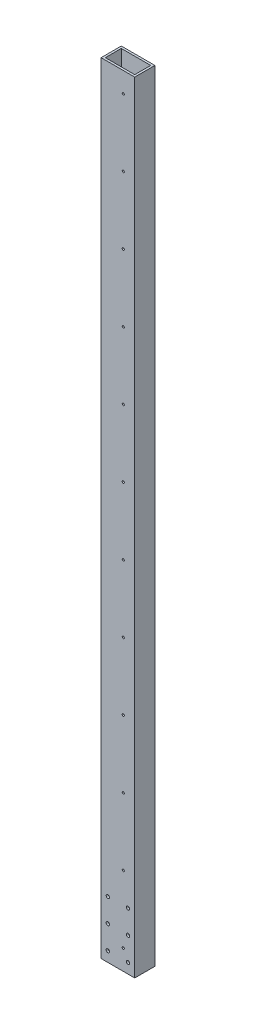
ISO-10303-21;
HEADER;
FILE_DESCRIPTION(('STEP AP214'),'2;1');
FILE_NAME('part.step','',(''),(''),'','','');
FILE_SCHEMA(('AUTOMOTIVE_DESIGN { 1 0 10303 214 1 1 1 1 }'));
ENDSEC;
DATA;
#1=APPLICATION_CONTEXT('core data for automotive mechanical design processes');
#2=APPLICATION_PROTOCOL_DEFINITION('international standard','automotive_design',2000,#1);
#3=PRODUCT_CONTEXT('',#1,'mechanical');
#4=PRODUCT('Part','Part','',(#3));
#5=PRODUCT_RELATED_PRODUCT_CATEGORY('part','',(#4));
#6=PRODUCT_DEFINITION_FORMATION('','',#4);
#7=PRODUCT_DEFINITION_CONTEXT('part definition',#1,'design');
#8=PRODUCT_DEFINITION('design','',#6,#7);
#9=PRODUCT_DEFINITION_SHAPE('','',#8);
#10=(LENGTH_UNIT() NAMED_UNIT(*) SI_UNIT(.MILLI.,.METRE.));
#11=(NAMED_UNIT(*) PLANE_ANGLE_UNIT() SI_UNIT($,.RADIAN.));
#12=(NAMED_UNIT(*) SI_UNIT($,.STERADIAN.) SOLID_ANGLE_UNIT());
#13=UNCERTAINTY_MEASURE_WITH_UNIT(LENGTH_MEASURE(1.E-05),#10,'distance_accuracy_value','');
#14=(GEOMETRIC_REPRESENTATION_CONTEXT(3) GLOBAL_UNCERTAINTY_ASSIGNED_CONTEXT((#13)) GLOBAL_UNIT_ASSIGNED_CONTEXT((#10,
#11,#12)) REPRESENTATION_CONTEXT('',''));
#15=CARTESIAN_POINT('',(0.,0.,0.));
#16=DIRECTION('',(0.,0.,1.));
#17=DIRECTION('',(1.,0.,0.));
#18=AXIS2_PLACEMENT_3D('',#15,#16,#17);
#19=CARTESIAN_POINT('',(0.,1473.2,0.));
#20=DIRECTION('',(0.,1.,0.));
#21=DIRECTION('',(0.,0.,1.));
#22=AXIS2_PLACEMENT_3D('',#19,#20,#21);
#23=PLANE('',#22);
#24=DIRECTION('',(0.,0.,1.));
#25=VECTOR('',#24,1.);
#26=CARTESIAN_POINT('',(-77.9742647058824,1473.2,5.57181372549019));
#27=LINE('',#26,#25);
#28=CARTESIAN_POINT('',(-77.9742647058824,1473.2,-32.5281862745098));
#29=VERTEX_POINT('',#28);
#30=CARTESIAN_POINT('',(-77.9742647058824,1473.2,5.57181372549019));
#31=VERTEX_POINT('',#30);
#32=EDGE_CURVE('E164',#29,#31,#27,.T.);
#33=ORIENTED_EDGE('',*,*,#32,.T.);
#34=DIRECTION('',(1.,0.,0.));
#35=VECTOR('',#34,1.);
#36=CARTESIAN_POINT('',(-77.9742647058824,1473.2,5.57181372549019));
#37=LINE('',#36,#35);
#38=CARTESIAN_POINT('',(-14.4742647058824,1473.2,5.57181372549019));
#39=VERTEX_POINT('',#38);
#40=EDGE_CURVE('E167',#31,#39,#37,.T.);
#41=ORIENTED_EDGE('',*,*,#40,.T.);
#42=DIRECTION('',(0.,0.,-1.));
#43=VECTOR('',#42,1.);
#44=CARTESIAN_POINT('',(-14.4742647058824,1473.2,5.57181372549019));
#45=LINE('',#44,#43);
#46=CARTESIAN_POINT('',(-14.4742647058824,1473.2,-32.5281862745098));
#47=VERTEX_POINT('',#46);
#48=EDGE_CURVE('E170',#39,#47,#45,.T.);
#49=ORIENTED_EDGE('',*,*,#48,.T.);
#50=DIRECTION('',(-1.,0.,0.));
#51=VECTOR('',#50,1.);
#52=CARTESIAN_POINT('',(-77.9742647058824,1473.2,-32.5281862745098));
#53=LINE('',#52,#51);
#54=EDGE_CURVE('E172',#47,#29,#53,.T.);
#55=ORIENTED_EDGE('',*,*,#54,.T.);
#56=EDGE_LOOP('',(#33,#41,#49,#55));
#57=FACE_BOUND('',#56,.T.);
#58=DIRECTION('',(1.,0.,0.));
#59=VECTOR('',#58,1.);
#60=CARTESIAN_POINT('',(0.,1473.2,1.60941372549019));
#61=LINE('',#60,#59);
#62=CARTESIAN_POINT('',(-74.0118647058824,1473.2,1.60941372549019));
#63=VERTEX_POINT('',#62);
#64=CARTESIAN_POINT('',(-18.4366647058824,1473.2,1.60941372549019));
#65=VERTEX_POINT('',#64);
#66=EDGE_CURVE('E134',#63,#65,#61,.T.);
#67=ORIENTED_EDGE('',*,*,#66,.F.);
#68=DIRECTION('',(0.,0.,1.));
#69=VECTOR('',#68,1.);
#70=CARTESIAN_POINT('',(-74.0118647058824,1473.2,0.));
#71=LINE('',#70,#69);
#72=CARTESIAN_POINT('',(-74.0118647058824,1473.2,-28.5657862745098));
#73=VERTEX_POINT('',#72);
#74=EDGE_CURVE('E126',#73,#63,#71,.T.);
#75=ORIENTED_EDGE('',*,*,#74,.F.);
#76=DIRECTION('',(-1.,0.,0.));
#77=VECTOR('',#76,1.);
#78=CARTESIAN_POINT('',(0.,1473.2,-28.5657862745098));
#79=LINE('',#78,#77);
#80=CARTESIAN_POINT('',(-18.4366647058824,1473.2,-28.5657862745098));
#81=VERTEX_POINT('',#80);
#82=EDGE_CURVE('E148',#81,#73,#79,.T.);
#83=ORIENTED_EDGE('',*,*,#82,.F.);
#84=DIRECTION('',(0.,0.,-1.));
#85=VECTOR('',#84,1.);
#86=CARTESIAN_POINT('',(-18.4366647058824,1473.2,0.));
#87=LINE('',#86,#85);
#88=EDGE_CURVE('E146',#65,#81,#87,.T.);
#89=ORIENTED_EDGE('',*,*,#88,.F.);
#90=EDGE_LOOP('',(#67,#75,#83,#89));
#91=FACE_BOUND('',#90,.T.);
#92=ADVANCED_FACE('F59',(#57,#91),#23,.T.);
#93=CARTESIAN_POINT('',(0.,0.,0.));
#94=DIRECTION('',(0.,1.,0.));
#95=DIRECTION('',(0.,0.,1.));
#96=AXIS2_PLACEMENT_3D('',#93,#94,#95);
#97=PLANE('',#96);
#98=DIRECTION('',(0.,0.,1.));
#99=VECTOR('',#98,1.);
#100=CARTESIAN_POINT('',(-77.9742647058824,0.,5.57181372549019));
#101=LINE('',#100,#99);
#102=CARTESIAN_POINT('',(-77.9742647058824,0.,-32.5281862745098));
#103=VERTEX_POINT('',#102);
#104=CARTESIAN_POINT('',(-77.9742647058824,0.,5.57181372549019));
#105=VERTEX_POINT('',#104);
#106=EDGE_CURVE('E142',#103,#105,#101,.T.);
#107=ORIENTED_EDGE('',*,*,#106,.F.);
#108=DIRECTION('',(-1.,0.,0.));
#109=VECTOR('',#108,1.);
#110=CARTESIAN_POINT('',(-77.9742647058824,0.,-32.5281862745098));
#111=LINE('',#110,#109);
#112=CARTESIAN_POINT('',(-14.4742647058824,0.,-32.5281862745098));
#113=VERTEX_POINT('',#112);
#114=EDGE_CURVE('E168',#113,#103,#111,.T.);
#115=ORIENTED_EDGE('',*,*,#114,.F.);
#116=DIRECTION('',(0.,0.,-1.));
#117=VECTOR('',#116,1.);
#118=CARTESIAN_POINT('',(-14.4742647058824,0.,5.57181372549019));
#119=LINE('',#118,#117);
#120=CARTESIAN_POINT('',(-14.4742647058824,0.,5.57181372549019));
#121=VERTEX_POINT('',#120);
#122=EDGE_CURVE('E179',#121,#113,#119,.T.);
#123=ORIENTED_EDGE('',*,*,#122,.F.);
#124=DIRECTION('',(1.,0.,0.));
#125=VECTOR('',#124,1.);
#126=CARTESIAN_POINT('',(-77.9742647058824,0.,5.57181372549019));
#127=LINE('',#126,#125);
#128=EDGE_CURVE('E177',#105,#121,#127,.T.);
#129=ORIENTED_EDGE('',*,*,#128,.F.);
#130=EDGE_LOOP('',(#107,#115,#123,#129));
#131=FACE_BOUND('',#130,.T.);
#132=DIRECTION('',(0.,0.,1.));
#133=VECTOR('',#132,1.);
#134=CARTESIAN_POINT('',(-74.0118647058824,0.,0.));
#135=LINE('',#134,#133);
#136=CARTESIAN_POINT('',(-74.0118647058824,0.,-28.5657862745098));
#137=VERTEX_POINT('',#136);
#138=CARTESIAN_POINT('',(-74.0118647058824,0.,1.60941372549019));
#139=VERTEX_POINT('',#138);
#140=EDGE_CURVE('E84',#137,#139,#135,.T.);
#141=ORIENTED_EDGE('',*,*,#140,.T.);
#142=DIRECTION('',(1.,0.,0.));
#143=VECTOR('',#142,1.);
#144=CARTESIAN_POINT('',(0.,0.,1.60941372549019));
#145=LINE('',#144,#143);
#146=CARTESIAN_POINT('',(-18.4366647058824,0.,1.60941372549019));
#147=VERTEX_POINT('',#146);
#148=EDGE_CURVE('E141',#139,#147,#145,.T.);
#149=ORIENTED_EDGE('',*,*,#148,.T.);
#150=DIRECTION('',(0.,0.,-1.));
#151=VECTOR('',#150,1.);
#152=CARTESIAN_POINT('',(-18.4366647058824,0.,0.));
#153=LINE('',#152,#151);
#154=CARTESIAN_POINT('',(-18.4366647058824,0.,-28.5657862745098));
#155=VERTEX_POINT('',#154);
#156=EDGE_CURVE('E156',#147,#155,#153,.T.);
#157=ORIENTED_EDGE('',*,*,#156,.T.);
#158=DIRECTION('',(-1.,0.,0.));
#159=VECTOR('',#158,1.);
#160=CARTESIAN_POINT('',(0.,0.,-28.5657862745098));
#161=LINE('',#160,#159);
#162=EDGE_CURVE('E135',#155,#137,#161,.T.);
#163=ORIENTED_EDGE('',*,*,#162,.T.);
#164=EDGE_LOOP('',(#141,#149,#157,#163));
#165=FACE_BOUND('',#164,.T.);
#166=ADVANCED_FACE('F352',(#131,#165),#97,.F.);
#167=CARTESIAN_POINT('',(-77.9742647058824,1473.2,5.57181372549019));
#168=DIRECTION('',(1.,0.,0.));
#169=DIRECTION('',(0.,0.,-1.));
#170=AXIS2_PLACEMENT_3D('',#167,#168,#169);
#171=PLANE('',#170);
#172=ORIENTED_EDGE('',*,*,#106,.T.);
#173=DIRECTION('',(0.,-1.,0.));
#174=VECTOR('',#173,1.);
#175=CARTESIAN_POINT('',(-77.9742647058824,1473.2,5.57181372549019));
#176=LINE('',#175,#174);
#177=EDGE_CURVE('E12',#31,#105,#176,.T.);
#178=ORIENTED_EDGE('',*,*,#177,.F.);
#179=ORIENTED_EDGE('',*,*,#32,.F.);
#180=DIRECTION('',(0.,-1.,0.));
#181=VECTOR('',#180,1.);
#182=CARTESIAN_POINT('',(-77.9742647058824,1473.2,-32.5281862745098));
#183=LINE('',#182,#181);
#184=EDGE_CURVE('E174',#29,#103,#183,.T.);
#185=ORIENTED_EDGE('',*,*,#184,.T.);
#186=EDGE_LOOP('',(#172,#178,#179,#185));
#187=FACE_BOUND('',#186,.T.);
#188=ADVANCED_FACE('F61',(#187),#171,.F.);
#189=CARTESIAN_POINT('',(-77.9742647058824,1473.2,5.57181372549019));
#190=DIRECTION('',(0.,0.,-1.));
#191=DIRECTION('',(-1.,0.,0.));
#192=AXIS2_PLACEMENT_3D('',#189,#190,#191);
#193=PLANE('',#192);
#194=CARTESIAN_POINT('',(-27.1742649276492,107.950000412582,5.57181372549019));
#195=DIRECTION('',(0.,0.,-1.));
#196=DIRECTION('',(-1.,0.,0.));
#197=AXIS2_PLACEMENT_3D('',#194,#195,#196);
#198=CIRCLE('',#197,3.17499999999998);
#199=CARTESIAN_POINT('',(-30.3492649276492,107.950000412582,5.57181372549019));
#200=VERTEX_POINT('',#199);
#201=EDGE_CURVE('E242',#200,#200,#198,.T.);
#202=ORIENTED_EDGE('',*,*,#201,.T.);
#203=EDGE_LOOP('',(#202));
#204=FACE_BOUND('',#203,.T.);
#205=CARTESIAN_POINT('',(-65.2742649276492,107.950000317398,5.57181372549019));
#206=DIRECTION('',(0.,0.,-1.));
#207=DIRECTION('',(-1.,0.,0.));
#208=AXIS2_PLACEMENT_3D('',#205,#206,#207);
#209=CIRCLE('',#208,3.17499999999998);
#210=CARTESIAN_POINT('',(-68.4492649276491,107.950000317398,5.57181372549019));
#211=VERTEX_POINT('',#210);
#212=EDGE_CURVE('E238',#211,#211,#209,.T.);
#213=ORIENTED_EDGE('',*,*,#212,.T.);
#214=EDGE_LOOP('',(#213));
#215=FACE_BOUND('',#214,.T.);
#216=CARTESIAN_POINT('',(-27.1742648166012,63.5000004125821,5.57181372549019));
#217=DIRECTION('',(0.,0.,-1.));
#218=DIRECTION('',(-1.,0.,0.));
#219=AXIS2_PLACEMENT_3D('',#216,#217,#218);
#220=CIRCLE('',#219,3.17499999999998);
#221=CARTESIAN_POINT('',(-30.3492648166012,63.5000004125821,5.57181372549019));
#222=VERTEX_POINT('',#221);
#223=EDGE_CURVE('E234',#222,#222,#220,.T.);
#224=ORIENTED_EDGE('',*,*,#223,.T.);
#225=EDGE_LOOP('',(#224));
#226=FACE_BOUND('',#225,.T.);
#227=CARTESIAN_POINT('',(-65.274264816601,63.5000003173981,5.57181372549019));
#228=DIRECTION('',(0.,0.,-1.));
#229=DIRECTION('',(-1.,0.,0.));
#230=AXIS2_PLACEMENT_3D('',#227,#228,#229);
#231=CIRCLE('',#230,3.17499999999998);
#232=CARTESIAN_POINT('',(-68.4492648166009,63.5000003173981,5.57181372549019));
#233=VERTEX_POINT('',#232);
#234=EDGE_CURVE('E229',#233,#233,#231,.T.);
#235=ORIENTED_EDGE('',*,*,#234,.T.);
#236=EDGE_LOOP('',(#235));
#237=FACE_BOUND('',#236,.T.);
#238=CARTESIAN_POINT('',(-27.1742647055528,19.050000412582,5.57181372549019));
#239=DIRECTION('',(0.,0.,-1.));
#240=DIRECTION('',(-1.,0.,0.));
#241=AXIS2_PLACEMENT_3D('',#238,#239,#240);
#242=CIRCLE('',#241,3.17499999999998);
#243=CARTESIAN_POINT('',(-30.3492647055527,19.050000412582,5.57181372549019));
#244=VERTEX_POINT('',#243);
#245=EDGE_CURVE('E224',#244,#244,#242,.T.);
#246=ORIENTED_EDGE('',*,*,#245,.T.);
#247=EDGE_LOOP('',(#246));
#248=FACE_BOUND('',#247,.T.);
#249=CARTESIAN_POINT('',(-65.274264705553,19.0500003173982,5.57181372549019));
#250=DIRECTION('',(0.,0.,-1.));
#251=DIRECTION('',(-1.,0.,0.));
#252=AXIS2_PLACEMENT_3D('',#249,#250,#251);
#253=CIRCLE('',#252,3.17499999999998);
#254=CARTESIAN_POINT('',(-68.4492647055529,19.0500003173982,5.57181372549019));
#255=VERTEX_POINT('',#254);
#256=EDGE_CURVE('E223',#255,#255,#253,.T.);
#257=ORIENTED_EDGE('',*,*,#256,.T.);
#258=EDGE_LOOP('',(#257));
#259=FACE_BOUND('',#258,.T.);
#260=CARTESIAN_POINT('',(-36.0642647058824,38.1,5.57181372549019));
#261=DIRECTION('',(0.,0.,1.));
#262=DIRECTION('',(1.,0.,0.));
#263=AXIS2_PLACEMENT_3D('',#260,#261,#262);
#264=CIRCLE('',#263,2.01929999999999);
#265=CARTESIAN_POINT('',(-34.0449647058824,38.1,5.57181372549019));
#266=VERTEX_POINT('',#265);
#267=EDGE_CURVE('E219',#266,#266,#264,.T.);
#268=ORIENTED_EDGE('',*,*,#267,.F.);
#269=EDGE_LOOP('',(#268));
#270=FACE_BOUND('',#269,.T.);
#271=CARTESIAN_POINT('',(-36.0642647058828,165.1,5.57181372549019));
#272=DIRECTION('',(0.,0.,1.));
#273=DIRECTION('',(1.,0.,0.));
#274=AXIS2_PLACEMENT_3D('',#271,#272,#273);
#275=CIRCLE('',#274,2.01929999999999);
#276=CARTESIAN_POINT('',(-34.0449647058828,165.1,5.57181372549019));
#277=VERTEX_POINT('',#276);
#278=EDGE_CURVE('E215',#277,#277,#275,.T.);
#279=ORIENTED_EDGE('',*,*,#278,.F.);
#280=EDGE_LOOP('',(#279));
#281=FACE_BOUND('',#280,.T.);
#282=CARTESIAN_POINT('',(-36.0642647058832,292.1,5.57181372549019));
#283=DIRECTION('',(0.,0.,1.));
#284=DIRECTION('',(1.,0.,0.));
#285=AXIS2_PLACEMENT_3D('',#282,#283,#284);
#286=CIRCLE('',#285,2.01929999999999);
#287=CARTESIAN_POINT('',(-34.0449647058833,292.1,5.57181372549019));
#288=VERTEX_POINT('',#287);
#289=EDGE_CURVE('E211',#288,#288,#286,.T.);
#290=ORIENTED_EDGE('',*,*,#289,.F.);
#291=EDGE_LOOP('',(#290));
#292=FACE_BOUND('',#291,.T.);
#293=CARTESIAN_POINT('',(-36.0642647058837,419.1,5.57181372549019));
#294=DIRECTION('',(0.,0.,1.));
#295=DIRECTION('',(1.,0.,0.));
#296=AXIS2_PLACEMENT_3D('',#293,#294,#295);
#297=CIRCLE('',#296,2.01929999999999);
#298=CARTESIAN_POINT('',(-34.0449647058837,419.1,5.57181372549019));
#299=VERTEX_POINT('',#298);
#300=EDGE_CURVE('E207',#299,#299,#297,.T.);
#301=ORIENTED_EDGE('',*,*,#300,.F.);
#302=EDGE_LOOP('',(#301));
#303=FACE_BOUND('',#302,.T.);
#304=CARTESIAN_POINT('',(-36.0642647058841,546.1,5.57181372549019));
#305=DIRECTION('',(0.,0.,1.));
#306=DIRECTION('',(1.,0.,0.));
#307=AXIS2_PLACEMENT_3D('',#304,#305,#306);
#308=CIRCLE('',#307,2.01929999999999);
#309=CARTESIAN_POINT('',(-34.0449647058841,546.1,5.57181372549019));
#310=VERTEX_POINT('',#309);
#311=EDGE_CURVE('E203',#310,#310,#308,.T.);
#312=ORIENTED_EDGE('',*,*,#311,.F.);
#313=EDGE_LOOP('',(#312));
#314=FACE_BOUND('',#313,.T.);
#315=CARTESIAN_POINT('',(-36.0642647058846,673.1,5.57181372549019));
#316=DIRECTION('',(0.,0.,1.));
#317=DIRECTION('',(1.,0.,0.));
#318=AXIS2_PLACEMENT_3D('',#315,#316,#317);
#319=CIRCLE('',#318,2.01929999999999);
#320=CARTESIAN_POINT('',(-34.0449647058846,673.1,5.57181372549019));
#321=VERTEX_POINT('',#320);
#322=EDGE_CURVE('E202',#321,#321,#319,.T.);
#323=ORIENTED_EDGE('',*,*,#322,.F.);
#324=EDGE_LOOP('',(#323));
#325=FACE_BOUND('',#324,.T.);
#326=CARTESIAN_POINT('',(-36.064264705885,800.1,5.57181372549019));
#327=DIRECTION('',(0.,0.,1.));
#328=DIRECTION('',(1.,0.,0.));
#329=AXIS2_PLACEMENT_3D('',#326,#327,#328);
#330=CIRCLE('',#329,2.01929999999999);
#331=CARTESIAN_POINT('',(-34.044964705885,800.1,5.57181372549019));
#332=VERTEX_POINT('',#331);
#333=EDGE_CURVE('E306',#332,#332,#330,.T.);
#334=ORIENTED_EDGE('',*,*,#333,.F.);
#335=EDGE_LOOP('',(#334));
#336=FACE_BOUND('',#335,.T.);
#337=CARTESIAN_POINT('',(-36.0642647058855,927.1,5.57181372549019));
#338=DIRECTION('',(0.,0.,1.));
#339=DIRECTION('',(1.,0.,0.));
#340=AXIS2_PLACEMENT_3D('',#337,#338,#339);
#341=CIRCLE('',#340,2.01929999999999);
#342=CARTESIAN_POINT('',(-34.0449647058855,927.1,5.57181372549019));
#343=VERTEX_POINT('',#342);
#344=EDGE_CURVE('E312',#343,#343,#341,.T.);
#345=ORIENTED_EDGE('',*,*,#344,.F.);
#346=EDGE_LOOP('',(#345));
#347=FACE_BOUND('',#346,.T.);
#348=CARTESIAN_POINT('',(-36.0642647058859,1054.1,5.57181372549019));
#349=DIRECTION('',(0.,0.,1.));
#350=DIRECTION('',(1.,0.,0.));
#351=AXIS2_PLACEMENT_3D('',#348,#349,#350);
#352=CIRCLE('',#351,2.01929999999999);
#353=CARTESIAN_POINT('',(-34.0449647058859,1054.1,5.57181372549019));
#354=VERTEX_POINT('',#353);
#355=EDGE_CURVE('E198',#354,#354,#352,.T.);
#356=ORIENTED_EDGE('',*,*,#355,.F.);
#357=EDGE_LOOP('',(#356));
#358=FACE_BOUND('',#357,.T.);
#359=CARTESIAN_POINT('',(-36.0642647058863,1181.1,5.57181372549019));
#360=DIRECTION('',(0.,0.,1.));
#361=DIRECTION('',(1.,0.,0.));
#362=AXIS2_PLACEMENT_3D('',#359,#360,#361);
#363=CIRCLE('',#362,2.01929999999999);
#364=CARTESIAN_POINT('',(-34.0449647058864,1181.1,5.57181372549019));
#365=VERTEX_POINT('',#364);
#366=EDGE_CURVE('E197',#365,#365,#363,.T.);
#367=ORIENTED_EDGE('',*,*,#366,.F.);
#368=EDGE_LOOP('',(#367));
#369=FACE_BOUND('',#368,.T.);
#370=CARTESIAN_POINT('',(-36.0642647058868,1308.1,5.57181372549019));
#371=DIRECTION('',(0.,0.,1.));
#372=DIRECTION('',(1.,0.,0.));
#373=AXIS2_PLACEMENT_3D('',#370,#371,#372);
#374=CIRCLE('',#373,2.01929999999999);
#375=CARTESIAN_POINT('',(-34.0449647058868,1308.1,5.57181372549019));
#376=VERTEX_POINT('',#375);
#377=EDGE_CURVE('E193',#376,#376,#374,.T.);
#378=ORIENTED_EDGE('',*,*,#377,.F.);
#379=EDGE_LOOP('',(#378));
#380=FACE_BOUND('',#379,.T.);
#381=CARTESIAN_POINT('',(-36.0642647058872,1435.1,5.57181372549019));
#382=DIRECTION('',(0.,0.,1.));
#383=DIRECTION('',(1.,0.,0.));
#384=AXIS2_PLACEMENT_3D('',#381,#382,#383);
#385=CIRCLE('',#384,2.01929999999999);
#386=CARTESIAN_POINT('',(-34.0449647058872,1435.1,5.57181372549019));
#387=VERTEX_POINT('',#386);
#388=EDGE_CURVE('E192',#387,#387,#385,.T.);
#389=ORIENTED_EDGE('',*,*,#388,.F.);
#390=EDGE_LOOP('',(#389));
#391=FACE_BOUND('',#390,.T.);
#392=ORIENTED_EDGE('',*,*,#128,.T.);
#393=DIRECTION('',(0.,-1.,0.));
#394=VECTOR('',#393,1.);
#395=CARTESIAN_POINT('',(-14.4742647058824,1473.2,5.57181372549019));
#396=LINE('',#395,#394);
#397=EDGE_CURVE('E68',#39,#121,#396,.T.);
#398=ORIENTED_EDGE('',*,*,#397,.F.);
#399=ORIENTED_EDGE('',*,*,#40,.F.);
#400=ORIENTED_EDGE('',*,*,#177,.T.);
#401=EDGE_LOOP('',(#392,#398,#399,#400));
#402=FACE_BOUND('',#401,.T.);
#403=ADVANCED_FACE('F365',(#204,#215,#226,#237,#248,#259,#270,#281,#292,#303,#314,#325,#336,
#347,#358,#369,#380,#391,#402),#193,.F.);
#404=CARTESIAN_POINT('',(-14.4742647058824,1473.2,5.57181372549019));
#405=DIRECTION('',(-1.,0.,0.));
#406=DIRECTION('',(0.,0.,1.));
#407=AXIS2_PLACEMENT_3D('',#404,#405,#406);
#408=PLANE('',#407);
#409=ORIENTED_EDGE('',*,*,#122,.T.);
#410=DIRECTION('',(0.,-1.,0.));
#411=VECTOR('',#410,1.);
#412=CARTESIAN_POINT('',(-14.4742647058824,1473.2,-32.5281862745098));
#413=LINE('',#412,#411);
#414=EDGE_CURVE('E184',#47,#113,#413,.T.);
#415=ORIENTED_EDGE('',*,*,#414,.F.);
#416=ORIENTED_EDGE('',*,*,#48,.F.);
#417=ORIENTED_EDGE('',*,*,#397,.T.);
#418=EDGE_LOOP('',(#409,#415,#416,#417));
#419=FACE_BOUND('',#418,.T.);
#420=ADVANCED_FACE('F362',(#419),#408,.F.);
#421=CARTESIAN_POINT('',(-77.9742647058824,1473.2,-32.5281862745098));
#422=DIRECTION('',(0.,0.,1.));
#423=DIRECTION('',(1.,0.,0.));
#424=AXIS2_PLACEMENT_3D('',#421,#422,#423);
#425=PLANE('',#424);
#426=CARTESIAN_POINT('',(-27.1742649332025,107.950000412582,-32.5281862745098));
#427=DIRECTION('',(0.,0.,1.));
#428=DIRECTION('',(1.,0.,0.));
#429=AXIS2_PLACEMENT_3D('',#426,#427,#428);
#430=CIRCLE('',#429,3.17499999999998);
#431=CARTESIAN_POINT('',(-23.9992649332025,107.950000412582,-32.5281862745098));
#432=VERTEX_POINT('',#431);
#433=EDGE_CURVE('E249',#432,#432,#430,.T.);
#434=ORIENTED_EDGE('',*,*,#433,.T.);
#435=EDGE_LOOP('',(#434));
#436=FACE_BOUND('',#435,.T.);
#437=CARTESIAN_POINT('',(-65.2742649332025,107.950000317398,-32.5281862745098));
#438=DIRECTION('',(0.,0.,1.));
#439=DIRECTION('',(1.,0.,0.));
#440=AXIS2_PLACEMENT_3D('',#437,#438,#439);
#441=CIRCLE('',#440,3.17499999999998);
#442=CARTESIAN_POINT('',(-62.0992649332025,107.950000317398,-32.5281862745098));
#443=VERTEX_POINT('',#442);
#444=EDGE_CURVE('E246',#443,#443,#441,.T.);
#445=ORIENTED_EDGE('',*,*,#444,.T.);
#446=EDGE_LOOP('',(#445));
#447=FACE_BOUND('',#446,.T.);
#448=CARTESIAN_POINT('',(-27.1742648221545,63.5000004125821,-32.5281862745098));
#449=DIRECTION('',(0.,0.,1.));
#450=DIRECTION('',(1.,0.,0.));
#451=AXIS2_PLACEMENT_3D('',#448,#449,#450);
#452=CIRCLE('',#451,3.17499999999998);
#453=CARTESIAN_POINT('',(-23.9992648221545,63.5000004125821,-32.5281862745098));
#454=VERTEX_POINT('',#453);
#455=EDGE_CURVE('E264',#454,#454,#452,.T.);
#456=ORIENTED_EDGE('',*,*,#455,.T.);
#457=EDGE_LOOP('',(#456));
#458=FACE_BOUND('',#457,.T.);
#459=CARTESIAN_POINT('',(-65.2742648221543,63.5000003173981,-32.5281862745098));
#460=DIRECTION('',(0.,0.,1.));
#461=DIRECTION('',(1.,0.,0.));
#462=AXIS2_PLACEMENT_3D('',#459,#460,#461);
#463=CIRCLE('',#462,3.17499999999998);
#464=CARTESIAN_POINT('',(-62.0992648221543,63.5000003173981,-32.5281862745098));
#465=VERTEX_POINT('',#464);
#466=EDGE_CURVE('E271',#465,#465,#463,.T.);
#467=ORIENTED_EDGE('',*,*,#466,.T.);
#468=EDGE_LOOP('',(#467));
#469=FACE_BOUND('',#468,.T.);
#470=CARTESIAN_POINT('',(-27.1742647111061,19.050000412582,-32.5281862745098));
#471=DIRECTION('',(0.,0.,1.));
#472=DIRECTION('',(1.,0.,0.));
#473=AXIS2_PLACEMENT_3D('',#470,#471,#472);
#474=CIRCLE('',#473,3.17499999999998);
#475=CARTESIAN_POINT('',(-23.9992647111061,19.050000412582,-32.5281862745098));
#476=VERTEX_POINT('',#475);
#477=EDGE_CURVE('E278',#476,#476,#474,.T.);
#478=ORIENTED_EDGE('',*,*,#477,.T.);
#479=EDGE_LOOP('',(#478));
#480=FACE_BOUND('',#479,.T.);
#481=CARTESIAN_POINT('',(-65.2742647111063,19.0500003173982,-32.5281862745098));
#482=DIRECTION('',(0.,0.,1.));
#483=DIRECTION('',(1.,0.,0.));
#484=AXIS2_PLACEMENT_3D('',#481,#482,#483);
#485=CIRCLE('',#484,3.17499999999998);
#486=CARTESIAN_POINT('',(-62.0992647111063,19.0500003173982,-32.5281862745098));
#487=VERTEX_POINT('',#486);
#488=EDGE_CURVE('E288',#487,#487,#485,.T.);
#489=ORIENTED_EDGE('',*,*,#488,.T.);
#490=EDGE_LOOP('',(#489));
#491=FACE_BOUND('',#490,.T.);
#492=ORIENTED_EDGE('',*,*,#114,.T.);
#493=ORIENTED_EDGE('',*,*,#184,.F.);
#494=ORIENTED_EDGE('',*,*,#54,.F.);
#495=ORIENTED_EDGE('',*,*,#414,.T.);
#496=EDGE_LOOP('',(#492,#493,#494,#495));
#497=FACE_BOUND('',#496,.T.);
#498=ADVANCED_FACE('F347',(#436,#447,#458,#469,#480,#491,#497),#425,.F.);
#499=CARTESIAN_POINT('',(-74.0118647058824,1473.2,0.));
#500=DIRECTION('',(1.,0.,0.));
#501=DIRECTION('',(0.,0.,-1.));
#502=AXIS2_PLACEMENT_3D('',#499,#500,#501);
#503=PLANE('',#502);
#504=ORIENTED_EDGE('',*,*,#140,.F.);
#505=DIRECTION('',(0.,-1.,0.));
#506=VECTOR('',#505,1.);
#507=CARTESIAN_POINT('',(-74.0118647058824,1473.2,-28.5657862745098));
#508=LINE('',#507,#506);
#509=EDGE_CURVE('E130',#73,#137,#508,.T.);
#510=ORIENTED_EDGE('',*,*,#509,.F.);
#511=ORIENTED_EDGE('',*,*,#74,.T.);
#512=DIRECTION('',(0.,-1.,0.));
#513=VECTOR('',#512,1.);
#514=CARTESIAN_POINT('',(-74.0118647058824,1473.2,1.60941372549019));
#515=LINE('',#514,#513);
#516=EDGE_CURVE('E129',#63,#139,#515,.T.);
#517=ORIENTED_EDGE('',*,*,#516,.T.);
#518=EDGE_LOOP('',(#504,#510,#511,#517));
#519=FACE_BOUND('',#518,.T.);
#520=ADVANCED_FACE('F128',(#519),#503,.T.);
#521=CARTESIAN_POINT('',(0.,1473.2,1.60941372549019));
#522=DIRECTION('',(0.,0.,-1.));
#523=DIRECTION('',(-1.,0.,0.));
#524=AXIS2_PLACEMENT_3D('',#521,#522,#523);
#525=PLANE('',#524);
#526=CARTESIAN_POINT('',(-27.1742649282268,107.950000412582,1.60941372549019));
#527=DIRECTION('',(0.,0.,-1.));
#528=DIRECTION('',(-1.,0.,0.));
#529=AXIS2_PLACEMENT_3D('',#526,#527,#528);
#530=CIRCLE('',#529,3.17499999999998);
#531=CARTESIAN_POINT('',(-30.3492649282267,107.950000412582,1.60941372549019));
#532=VERTEX_POINT('',#531);
#533=EDGE_CURVE('E63',#532,#532,#530,.T.);
#534=ORIENTED_EDGE('',*,*,#533,.F.);
#535=EDGE_LOOP('',(#534));
#536=FACE_BOUND('',#535,.T.);
#537=CARTESIAN_POINT('',(-65.2742649282267,107.950000317398,1.60941372549019));
#538=DIRECTION('',(0.,0.,-1.));
#539=DIRECTION('',(-1.,0.,0.));
#540=AXIS2_PLACEMENT_3D('',#537,#538,#539);
#541=CIRCLE('',#540,3.17499999999998);
#542=CARTESIAN_POINT('',(-68.4492649282267,107.950000317398,1.60941372549019));
#543=VERTEX_POINT('',#542);
#544=EDGE_CURVE('E239',#543,#543,#541,.T.);
#545=ORIENTED_EDGE('',*,*,#544,.F.);
#546=EDGE_LOOP('',(#545));
#547=FACE_BOUND('',#546,.T.);
#548=CARTESIAN_POINT('',(-27.1742648171788,63.5000004125821,1.60941372549019));
#549=DIRECTION('',(0.,0.,-1.));
#550=DIRECTION('',(-1.,0.,0.));
#551=AXIS2_PLACEMENT_3D('',#548,#549,#550);
#552=CIRCLE('',#551,3.17499999999998);
#553=CARTESIAN_POINT('',(-30.3492648171787,63.5000004125821,1.60941372549019));
#554=VERTEX_POINT('',#553);
#555=EDGE_CURVE('E235',#554,#554,#552,.T.);
#556=ORIENTED_EDGE('',*,*,#555,.F.);
#557=EDGE_LOOP('',(#556));
#558=FACE_BOUND('',#557,.T.);
#559=CARTESIAN_POINT('',(-65.2742648171785,63.5000003173981,1.60941372549019));
#560=DIRECTION('',(0.,0.,-1.));
#561=DIRECTION('',(-1.,0.,0.));
#562=AXIS2_PLACEMENT_3D('',#559,#560,#561);
#563=CIRCLE('',#562,3.17499999999998);
#564=CARTESIAN_POINT('',(-68.4492648171785,63.5000003173981,1.60941372549019));
#565=VERTEX_POINT('',#564);
#566=EDGE_CURVE('E230',#565,#565,#563,.T.);
#567=ORIENTED_EDGE('',*,*,#566,.F.);
#568=EDGE_LOOP('',(#567));
#569=FACE_BOUND('',#568,.T.);
#570=CARTESIAN_POINT('',(-27.1742647061303,19.050000412582,1.60941372549019));
#571=DIRECTION('',(0.,0.,-1.));
#572=DIRECTION('',(-1.,0.,0.));
#573=AXIS2_PLACEMENT_3D('',#570,#571,#572);
#574=CIRCLE('',#573,3.17499999999998);
#575=CARTESIAN_POINT('',(-30.3492647061303,19.050000412582,1.60941372549019));
#576=VERTEX_POINT('',#575);
#577=EDGE_CURVE('E225',#576,#576,#574,.T.);
#578=ORIENTED_EDGE('',*,*,#577,.F.);
#579=EDGE_LOOP('',(#578));
#580=FACE_BOUND('',#579,.T.);
#581=CARTESIAN_POINT('',(-65.2742647061305,19.0500003173982,1.60941372549019));
#582=DIRECTION('',(0.,0.,-1.));
#583=DIRECTION('',(-1.,0.,0.));
#584=AXIS2_PLACEMENT_3D('',#581,#582,#583);
#585=CIRCLE('',#584,3.17499999999998);
#586=CARTESIAN_POINT('',(-68.4492647061305,19.0500003173982,1.60941372549019));
#587=VERTEX_POINT('',#586);
#588=EDGE_CURVE('E220',#587,#587,#585,.T.);
#589=ORIENTED_EDGE('',*,*,#588,.F.);
#590=EDGE_LOOP('',(#589));
#591=FACE_BOUND('',#590,.T.);
#592=CARTESIAN_POINT('',(-36.0642647058824,38.1,1.60941372549019));
#593=DIRECTION('',(0.,0.,-1.));
#594=DIRECTION('',(-1.,0.,0.));
#595=AXIS2_PLACEMENT_3D('',#592,#593,#594);
#596=CIRCLE('',#595,2.01929999999999);
#597=CARTESIAN_POINT('',(-38.0835647058823,38.1,1.60941372549019));
#598=VERTEX_POINT('',#597);
#599=EDGE_CURVE('E216',#598,#598,#596,.T.);
#600=ORIENTED_EDGE('',*,*,#599,.F.);
#601=EDGE_LOOP('',(#600));
#602=FACE_BOUND('',#601,.T.);
#603=CARTESIAN_POINT('',(-36.0642647058828,165.1,1.60941372549019));
#604=DIRECTION('',(0.,0.,-1.));
#605=DIRECTION('',(-1.,0.,0.));
#606=AXIS2_PLACEMENT_3D('',#603,#604,#605);
#607=CIRCLE('',#606,2.01929999999999);
#608=CARTESIAN_POINT('',(-38.0835647058828,165.1,1.60941372549019));
#609=VERTEX_POINT('',#608);
#610=EDGE_CURVE('E212',#609,#609,#607,.T.);
#611=ORIENTED_EDGE('',*,*,#610,.F.);
#612=EDGE_LOOP('',(#611));
#613=FACE_BOUND('',#612,.T.);
#614=CARTESIAN_POINT('',(-36.0642647058832,292.1,1.60941372549019));
#615=DIRECTION('',(0.,0.,-1.));
#616=DIRECTION('',(-1.,0.,0.));
#617=AXIS2_PLACEMENT_3D('',#614,#615,#616);
#618=CIRCLE('',#617,2.01929999999999);
#619=CARTESIAN_POINT('',(-38.0835647058832,292.1,1.60941372549019));
#620=VERTEX_POINT('',#619);
#621=EDGE_CURVE('E208',#620,#620,#618,.T.);
#622=ORIENTED_EDGE('',*,*,#621,.F.);
#623=EDGE_LOOP('',(#622));
#624=FACE_BOUND('',#623,.T.);
#625=CARTESIAN_POINT('',(-36.0642647058837,419.1,1.60941372549019));
#626=DIRECTION('',(0.,0.,-1.));
#627=DIRECTION('',(-1.,0.,0.));
#628=AXIS2_PLACEMENT_3D('',#625,#626,#627);
#629=CIRCLE('',#628,2.01929999999999);
#630=CARTESIAN_POINT('',(-38.0835647058837,419.1,1.60941372549019));
#631=VERTEX_POINT('',#630);
#632=EDGE_CURVE('E204',#631,#631,#629,.T.);
#633=ORIENTED_EDGE('',*,*,#632,.F.);
#634=EDGE_LOOP('',(#633));
#635=FACE_BOUND('',#634,.T.);
#636=CARTESIAN_POINT('',(-36.0642647058841,546.1,1.60941372549019));
#637=DIRECTION('',(0.,0.,-1.));
#638=DIRECTION('',(-1.,0.,0.));
#639=AXIS2_PLACEMENT_3D('',#636,#637,#638);
#640=CIRCLE('',#639,2.01929999999999);
#641=CARTESIAN_POINT('',(-38.0835647058841,546.1,1.60941372549019));
#642=VERTEX_POINT('',#641);
#643=EDGE_CURVE('E199',#642,#642,#640,.T.);
#644=ORIENTED_EDGE('',*,*,#643,.F.);
#645=EDGE_LOOP('',(#644));
#646=FACE_BOUND('',#645,.T.);
#647=CARTESIAN_POINT('',(-36.0642647058846,673.1,1.60941372549019));
#648=DIRECTION('',(0.,0.,-1.));
#649=DIRECTION('',(-1.,0.,0.));
#650=AXIS2_PLACEMENT_3D('',#647,#648,#649);
#651=CIRCLE('',#650,2.01929999999999);
#652=CARTESIAN_POINT('',(-38.0835647058846,673.1,1.60941372549019));
#653=VERTEX_POINT('',#652);
#654=EDGE_CURVE('E303',#653,#653,#651,.T.);
#655=ORIENTED_EDGE('',*,*,#654,.F.);
#656=EDGE_LOOP('',(#655));
#657=FACE_BOUND('',#656,.T.);
#658=CARTESIAN_POINT('',(-36.064264705885,800.1,1.60941372549019));
#659=DIRECTION('',(0.,0.,-1.));
#660=DIRECTION('',(-1.,0.,0.));
#661=AXIS2_PLACEMENT_3D('',#658,#659,#660);
#662=CIRCLE('',#661,2.01929999999999);
#663=CARTESIAN_POINT('',(-38.083564705885,800.1,1.60941372549019));
#664=VERTEX_POINT('',#663);
#665=EDGE_CURVE('E309',#664,#664,#662,.T.);
#666=ORIENTED_EDGE('',*,*,#665,.F.);
#667=EDGE_LOOP('',(#666));
#668=FACE_BOUND('',#667,.T.);
#669=CARTESIAN_POINT('',(-36.0642647058855,927.1,1.60941372549019));
#670=DIRECTION('',(0.,0.,-1.));
#671=DIRECTION('',(-1.,0.,0.));
#672=AXIS2_PLACEMENT_3D('',#669,#670,#671);
#673=CIRCLE('',#672,2.01929999999999);
#674=CARTESIAN_POINT('',(-38.0835647058855,927.1,1.60941372549019));
#675=VERTEX_POINT('',#674);
#676=EDGE_CURVE('E315',#675,#675,#673,.T.);
#677=ORIENTED_EDGE('',*,*,#676,.F.);
#678=EDGE_LOOP('',(#677));
#679=FACE_BOUND('',#678,.T.);
#680=CARTESIAN_POINT('',(-36.0642647058859,1054.1,1.60941372549019));
#681=DIRECTION('',(0.,0.,-1.));
#682=DIRECTION('',(-1.,0.,0.));
#683=AXIS2_PLACEMENT_3D('',#680,#681,#682);
#684=CIRCLE('',#683,2.01929999999999);
#685=CARTESIAN_POINT('',(-38.0835647058859,1054.1,1.60941372549019));
#686=VERTEX_POINT('',#685);
#687=EDGE_CURVE('E194',#686,#686,#684,.T.);
#688=ORIENTED_EDGE('',*,*,#687,.F.);
#689=EDGE_LOOP('',(#688));
#690=FACE_BOUND('',#689,.T.);
#691=CARTESIAN_POINT('',(-36.0642647058863,1181.1,1.60941372549019));
#692=DIRECTION('',(0.,0.,-1.));
#693=DIRECTION('',(-1.,0.,0.));
#694=AXIS2_PLACEMENT_3D('',#691,#692,#693);
#695=CIRCLE('',#694,2.01929999999999);
#696=CARTESIAN_POINT('',(-38.0835647058863,1181.1,1.60941372549019));
#697=VERTEX_POINT('',#696);
#698=EDGE_CURVE('E322',#697,#697,#695,.T.);
#699=ORIENTED_EDGE('',*,*,#698,.F.);
#700=EDGE_LOOP('',(#699));
#701=FACE_BOUND('',#700,.T.);
#702=CARTESIAN_POINT('',(-36.0642647058868,1308.1,1.60941372549019));
#703=DIRECTION('',(0.,0.,-1.));
#704=DIRECTION('',(-1.,0.,0.));
#705=AXIS2_PLACEMENT_3D('',#702,#703,#704);
#706=CIRCLE('',#705,2.01929999999999);
#707=CARTESIAN_POINT('',(-38.0835647058868,1308.1,1.60941372549019));
#708=VERTEX_POINT('',#707);
#709=EDGE_CURVE('E189',#708,#708,#706,.T.);
#710=ORIENTED_EDGE('',*,*,#709,.F.);
#711=EDGE_LOOP('',(#710));
#712=FACE_BOUND('',#711,.T.);
#713=CARTESIAN_POINT('',(-36.0642647058872,1435.1,1.60941372549019));
#714=DIRECTION('',(0.,0.,-1.));
#715=DIRECTION('',(-1.,0.,0.));
#716=AXIS2_PLACEMENT_3D('',#713,#714,#715);
#717=CIRCLE('',#716,2.01929999999999);
#718=CARTESIAN_POINT('',(-38.0835647058872,1435.1,1.60941372549019));
#719=VERTEX_POINT('',#718);
#720=EDGE_CURVE('E154',#719,#719,#717,.T.);
#721=ORIENTED_EDGE('',*,*,#720,.F.);
#722=EDGE_LOOP('',(#721));
#723=FACE_BOUND('',#722,.T.);
#724=ORIENTED_EDGE('',*,*,#148,.F.);
#725=ORIENTED_EDGE('',*,*,#516,.F.);
#726=ORIENTED_EDGE('',*,*,#66,.T.);
#727=DIRECTION('',(0.,-1.,0.));
#728=VECTOR('',#727,1.);
#729=CARTESIAN_POINT('',(-18.4366647058824,1473.2,1.60941372549019));
#730=LINE('',#729,#728);
#731=EDGE_CURVE('E143',#65,#147,#730,.T.);
#732=ORIENTED_EDGE('',*,*,#731,.T.);
#733=EDGE_LOOP('',(#724,#725,#726,#732));
#734=FACE_BOUND('',#733,.T.);
#735=ADVANCED_FACE('F138',(#536,#547,#558,#569,#580,#591,#602,#613,#624,#635,#646,#657,#668,
#679,#690,#701,#712,#723,#734),#525,.T.);
#736=CARTESIAN_POINT('',(-18.4366647058824,1473.2,0.));
#737=DIRECTION('',(-1.,0.,0.));
#738=DIRECTION('',(0.,0.,1.));
#739=AXIS2_PLACEMENT_3D('',#736,#737,#738);
#740=PLANE('',#739);
#741=ORIENTED_EDGE('',*,*,#156,.F.);
#742=ORIENTED_EDGE('',*,*,#731,.F.);
#743=ORIENTED_EDGE('',*,*,#88,.T.);
#744=DIRECTION('',(0.,-1.,0.));
#745=VECTOR('',#744,1.);
#746=CARTESIAN_POINT('',(-18.4366647058824,1473.2,-28.5657862745098));
#747=LINE('',#746,#745);
#748=EDGE_CURVE('E76',#81,#155,#747,.T.);
#749=ORIENTED_EDGE('',*,*,#748,.T.);
#750=EDGE_LOOP('',(#741,#742,#743,#749));
#751=FACE_BOUND('',#750,.T.);
#752=ADVANCED_FACE('F335',(#751),#740,.T.);
#753=CARTESIAN_POINT('',(0.,1473.2,-28.5657862745098));
#754=DIRECTION('',(0.,0.,1.));
#755=DIRECTION('',(1.,0.,0.));
#756=AXIS2_PLACEMENT_3D('',#753,#754,#755);
#757=PLANE('',#756);
#758=CARTESIAN_POINT('',(-27.174264932625,107.950000412582,-28.5657862745098));
#759=DIRECTION('',(0.,0.,1.));
#760=DIRECTION('',(1.,0.,0.));
#761=AXIS2_PLACEMENT_3D('',#758,#759,#760);
#762=CIRCLE('',#761,3.17499999999998);
#763=CARTESIAN_POINT('',(-23.999264932625,107.950000412582,-28.5657862745098));
#764=VERTEX_POINT('',#763);
#765=EDGE_CURVE('E254',#764,#764,#762,.T.);
#766=ORIENTED_EDGE('',*,*,#765,.F.);
#767=EDGE_LOOP('',(#766));
#768=FACE_BOUND('',#767,.T.);
#769=CARTESIAN_POINT('',(-65.2742649326249,107.950000317398,-28.5657862745098));
#770=DIRECTION('',(0.,0.,1.));
#771=DIRECTION('',(1.,0.,0.));
#772=AXIS2_PLACEMENT_3D('',#769,#770,#771);
#773=CIRCLE('',#772,3.17499999999998);
#774=CARTESIAN_POINT('',(-62.0992649326249,107.950000317398,-28.5657862745098));
#775=VERTEX_POINT('',#774);
#776=EDGE_CURVE('E241',#775,#775,#773,.T.);
#777=ORIENTED_EDGE('',*,*,#776,.F.);
#778=EDGE_LOOP('',(#777));
#779=FACE_BOUND('',#778,.T.);
#780=CARTESIAN_POINT('',(-27.174264821577,63.5000004125821,-28.5657862745098));
#781=DIRECTION('',(0.,0.,1.));
#782=DIRECTION('',(1.,0.,0.));
#783=AXIS2_PLACEMENT_3D('',#780,#781,#782);
#784=CIRCLE('',#783,3.17499999999998);
#785=CARTESIAN_POINT('',(-23.999264821577,63.5000004125821,-28.5657862745098));
#786=VERTEX_POINT('',#785);
#787=EDGE_CURVE('E237',#786,#786,#784,.T.);
#788=ORIENTED_EDGE('',*,*,#787,.F.);
#789=EDGE_LOOP('',(#788));
#790=FACE_BOUND('',#789,.T.);
#791=CARTESIAN_POINT('',(-65.2742648215767,63.5000003173981,-28.5657862745098));
#792=DIRECTION('',(0.,0.,1.));
#793=DIRECTION('',(1.,0.,0.));
#794=AXIS2_PLACEMENT_3D('',#791,#792,#793);
#795=CIRCLE('',#794,3.17499999999998);
#796=CARTESIAN_POINT('',(-62.0992648215767,63.5000003173981,-28.5657862745098));
#797=VERTEX_POINT('',#796);
#798=EDGE_CURVE('E233',#797,#797,#795,.T.);
#799=ORIENTED_EDGE('',*,*,#798,.F.);
#800=EDGE_LOOP('',(#799));
#801=FACE_BOUND('',#800,.T.);
#802=CARTESIAN_POINT('',(-27.1742647105285,19.050000412582,-28.5657862745098));
#803=DIRECTION('',(0.,0.,1.));
#804=DIRECTION('',(1.,0.,0.));
#805=AXIS2_PLACEMENT_3D('',#802,#803,#804);
#806=CIRCLE('',#805,3.17499999999998);
#807=CARTESIAN_POINT('',(-23.9992647105285,19.050000412582,-28.5657862745098));
#808=VERTEX_POINT('',#807);
#809=EDGE_CURVE('E228',#808,#808,#806,.T.);
#810=ORIENTED_EDGE('',*,*,#809,.F.);
#811=EDGE_LOOP('',(#810));
#812=FACE_BOUND('',#811,.T.);
#813=CARTESIAN_POINT('',(-65.2742647105287,19.0500003173982,-28.5657862745098));
#814=DIRECTION('',(0.,0.,1.));
#815=DIRECTION('',(1.,0.,0.));
#816=AXIS2_PLACEMENT_3D('',#813,#814,#815);
#817=CIRCLE('',#816,3.17499999999998);
#818=CARTESIAN_POINT('',(-62.0992647105287,19.0500003173982,-28.5657862745098));
#819=VERTEX_POINT('',#818);
#820=EDGE_CURVE('E285',#819,#819,#817,.T.);
#821=ORIENTED_EDGE('',*,*,#820,.F.);
#822=EDGE_LOOP('',(#821));
#823=FACE_BOUND('',#822,.T.);
#824=ORIENTED_EDGE('',*,*,#162,.F.);
#825=ORIENTED_EDGE('',*,*,#748,.F.);
#826=ORIENTED_EDGE('',*,*,#82,.T.);
#827=ORIENTED_EDGE('',*,*,#509,.T.);
#828=EDGE_LOOP('',(#824,#825,#826,#827));
#829=FACE_BOUND('',#828,.T.);
#830=ADVANCED_FACE('F343',(#768,#779,#790,#801,#812,#823,#829),#757,.T.);
#831=CARTESIAN_POINT('',(-36.0642647058872,1435.1,5.57181372549019));
#832=DIRECTION('',(0.,0.,1.));
#833=DIRECTION('',(1.,0.,0.));
#834=AXIS2_PLACEMENT_3D('',#831,#832,#833);
#835=CYLINDRICAL_SURFACE('',#834,2.01929999999999);
#836=ORIENTED_EDGE('',*,*,#720,.T.);
#837=EDGE_LOOP('',(#836));
#838=FACE_BOUND('',#837,.T.);
#839=ORIENTED_EDGE('',*,*,#388,.T.);
#840=EDGE_LOOP('',(#839));
#841=FACE_BOUND('',#840,.T.);
#842=ADVANCED_FACE('F331',(#838,#841),#835,.F.);
#843=CARTESIAN_POINT('',(-36.0642647058868,1308.1,5.57181372549019));
#844=DIRECTION('',(0.,0.,1.));
#845=DIRECTION('',(1.,0.,0.));
#846=AXIS2_PLACEMENT_3D('',#843,#844,#845);
#847=CYLINDRICAL_SURFACE('',#846,2.01929999999999);
#848=ORIENTED_EDGE('',*,*,#709,.T.);
#849=EDGE_LOOP('',(#848));
#850=FACE_BOUND('',#849,.T.);
#851=ORIENTED_EDGE('',*,*,#377,.T.);
#852=EDGE_LOOP('',(#851));
#853=FACE_BOUND('',#852,.T.);
#854=ADVANCED_FACE('F427',(#850,#853),#847,.F.);
#855=CARTESIAN_POINT('',(-36.0642647058863,1181.1,5.57181372549019));
#856=DIRECTION('',(0.,0.,1.));
#857=DIRECTION('',(1.,0.,0.));
#858=AXIS2_PLACEMENT_3D('',#855,#856,#857);
#859=CYLINDRICAL_SURFACE('',#858,2.01929999999999);
#860=ORIENTED_EDGE('',*,*,#698,.T.);
#861=EDGE_LOOP('',(#860));
#862=FACE_BOUND('',#861,.T.);
#863=ORIENTED_EDGE('',*,*,#366,.T.);
#864=EDGE_LOOP('',(#863));
#865=FACE_BOUND('',#864,.T.);
#866=ADVANCED_FACE('F434',(#862,#865),#859,.F.);
#867=CARTESIAN_POINT('',(-36.0642647058859,1054.1,5.57181372549019));
#868=DIRECTION('',(0.,0.,1.));
#869=DIRECTION('',(1.,0.,0.));
#870=AXIS2_PLACEMENT_3D('',#867,#868,#869);
#871=CYLINDRICAL_SURFACE('',#870,2.01929999999999);
#872=ORIENTED_EDGE('',*,*,#687,.T.);
#873=EDGE_LOOP('',(#872));
#874=FACE_BOUND('',#873,.T.);
#875=ORIENTED_EDGE('',*,*,#355,.T.);
#876=EDGE_LOOP('',(#875));
#877=FACE_BOUND('',#876,.T.);
#878=ADVANCED_FACE('F438',(#874,#877),#871,.F.);
#879=CARTESIAN_POINT('',(-36.0642647058855,927.1,5.57181372549019));
#880=DIRECTION('',(0.,0.,1.));
#881=DIRECTION('',(1.,0.,0.));
#882=AXIS2_PLACEMENT_3D('',#879,#880,#881);
#883=CYLINDRICAL_SURFACE('',#882,2.01929999999999);
#884=ORIENTED_EDGE('',*,*,#676,.T.);
#885=EDGE_LOOP('',(#884));
#886=FACE_BOUND('',#885,.T.);
#887=ORIENTED_EDGE('',*,*,#344,.T.);
#888=EDGE_LOOP('',(#887));
#889=FACE_BOUND('',#888,.T.);
#890=ADVANCED_FACE('F442',(#886,#889),#883,.F.);
#891=CARTESIAN_POINT('',(-36.064264705885,800.1,5.57181372549019));
#892=DIRECTION('',(0.,0.,1.));
#893=DIRECTION('',(1.,0.,0.));
#894=AXIS2_PLACEMENT_3D('',#891,#892,#893);
#895=CYLINDRICAL_SURFACE('',#894,2.01929999999999);
#896=ORIENTED_EDGE('',*,*,#665,.T.);
#897=EDGE_LOOP('',(#896));
#898=FACE_BOUND('',#897,.T.);
#899=ORIENTED_EDGE('',*,*,#333,.T.);
#900=EDGE_LOOP('',(#899));
#901=FACE_BOUND('',#900,.T.);
#902=ADVANCED_FACE('F446',(#898,#901),#895,.F.);
#903=CARTESIAN_POINT('',(-36.0642647058846,673.1,5.57181372549019));
#904=DIRECTION('',(0.,0.,1.));
#905=DIRECTION('',(1.,0.,0.));
#906=AXIS2_PLACEMENT_3D('',#903,#904,#905);
#907=CYLINDRICAL_SURFACE('',#906,2.01929999999999);
#908=ORIENTED_EDGE('',*,*,#654,.T.);
#909=EDGE_LOOP('',(#908));
#910=FACE_BOUND('',#909,.T.);
#911=ORIENTED_EDGE('',*,*,#322,.T.);
#912=EDGE_LOOP('',(#911));
#913=FACE_BOUND('',#912,.T.);
#914=ADVANCED_FACE('F450',(#910,#913),#907,.F.);
#915=CARTESIAN_POINT('',(-36.0642647058841,546.1,5.57181372549019));
#916=DIRECTION('',(0.,0.,1.));
#917=DIRECTION('',(1.,0.,0.));
#918=AXIS2_PLACEMENT_3D('',#915,#916,#917);
#919=CYLINDRICAL_SURFACE('',#918,2.01929999999999);
#920=ORIENTED_EDGE('',*,*,#643,.T.);
#921=EDGE_LOOP('',(#920));
#922=FACE_BOUND('',#921,.T.);
#923=ORIENTED_EDGE('',*,*,#311,.T.);
#924=EDGE_LOOP('',(#923));
#925=FACE_BOUND('',#924,.T.);
#926=ADVANCED_FACE('F454',(#922,#925),#919,.F.);
#927=CARTESIAN_POINT('',(-36.0642647058837,419.1,5.57181372549019));
#928=DIRECTION('',(0.,0.,1.));
#929=DIRECTION('',(1.,0.,0.));
#930=AXIS2_PLACEMENT_3D('',#927,#928,#929);
#931=CYLINDRICAL_SURFACE('',#930,2.01929999999999);
#932=ORIENTED_EDGE('',*,*,#632,.T.);
#933=EDGE_LOOP('',(#932));
#934=FACE_BOUND('',#933,.T.);
#935=ORIENTED_EDGE('',*,*,#300,.T.);
#936=EDGE_LOOP('',(#935));
#937=FACE_BOUND('',#936,.T.);
#938=ADVANCED_FACE('F458',(#934,#937),#931,.F.);
#939=CARTESIAN_POINT('',(-36.0642647058832,292.1,5.57181372549019));
#940=DIRECTION('',(0.,0.,1.));
#941=DIRECTION('',(1.,0.,0.));
#942=AXIS2_PLACEMENT_3D('',#939,#940,#941);
#943=CYLINDRICAL_SURFACE('',#942,2.01929999999999);
#944=ORIENTED_EDGE('',*,*,#621,.T.);
#945=EDGE_LOOP('',(#944));
#946=FACE_BOUND('',#945,.T.);
#947=ORIENTED_EDGE('',*,*,#289,.T.);
#948=EDGE_LOOP('',(#947));
#949=FACE_BOUND('',#948,.T.);
#950=ADVANCED_FACE('F462',(#946,#949),#943,.F.);
#951=CARTESIAN_POINT('',(-36.0642647058828,165.1,5.57181372549019));
#952=DIRECTION('',(0.,0.,1.));
#953=DIRECTION('',(1.,0.,0.));
#954=AXIS2_PLACEMENT_3D('',#951,#952,#953);
#955=CYLINDRICAL_SURFACE('',#954,2.01929999999999);
#956=ORIENTED_EDGE('',*,*,#610,.T.);
#957=EDGE_LOOP('',(#956));
#958=FACE_BOUND('',#957,.T.);
#959=ORIENTED_EDGE('',*,*,#278,.T.);
#960=EDGE_LOOP('',(#959));
#961=FACE_BOUND('',#960,.T.);
#962=ADVANCED_FACE('F466',(#958,#961),#955,.F.);
#963=CARTESIAN_POINT('',(-36.0642647058824,38.1,5.57181372549019));
#964=DIRECTION('',(0.,0.,1.));
#965=DIRECTION('',(1.,0.,0.));
#966=AXIS2_PLACEMENT_3D('',#963,#964,#965);
#967=CYLINDRICAL_SURFACE('',#966,2.01929999999999);
#968=ORIENTED_EDGE('',*,*,#599,.T.);
#969=EDGE_LOOP('',(#968));
#970=FACE_BOUND('',#969,.T.);
#971=ORIENTED_EDGE('',*,*,#267,.T.);
#972=EDGE_LOOP('',(#971));
#973=FACE_BOUND('',#972,.T.);
#974=ADVANCED_FACE('F470',(#970,#973),#967,.F.);
#975=CARTESIAN_POINT('',(-65.2742647116246,19.0500003173982,-36.0841862661183));
#976=DIRECTION('',(-1.45755902451401E-10,0.,-1.));
#977=DIRECTION('',(-1.,0.,1.45755902451401E-10));
#978=AXIS2_PLACEMENT_3D('',#975,#976,#977);
#979=CYLINDRICAL_SURFACE('',#978,3.17499999999998);
#980=ORIENTED_EDGE('',*,*,#588,.T.);
#981=EDGE_LOOP('',(#980));
#982=FACE_BOUND('',#981,.T.);
#983=ORIENTED_EDGE('',*,*,#256,.F.);
#984=EDGE_LOOP('',(#983));
#985=FACE_BOUND('',#984,.T.);
#986=ADVANCED_FACE('F474',(#982,#985),#979,.F.);
#987=ORIENTED_EDGE('',*,*,#820,.T.);
#988=EDGE_LOOP('',(#987));
#989=FACE_BOUND('',#988,.T.);
#990=ORIENTED_EDGE('',*,*,#488,.F.);
#991=EDGE_LOOP('',(#990));
#992=FACE_BOUND('',#991,.T.);
#993=ADVANCED_FACE('F476',(#989,#992),#979,.F.);
#994=CARTESIAN_POINT('',(-27.1742647116244,19.050000412582,-36.084186272412));
#995=DIRECTION('',(-1.45755902451401E-10,0.,-1.));
#996=DIRECTION('',(-1.,0.,1.45755902451401E-10));
#997=AXIS2_PLACEMENT_3D('',#994,#995,#996);
#998=CYLINDRICAL_SURFACE('',#997,3.17499999999998);
#999=ORIENTED_EDGE('',*,*,#577,.T.);
#1000=EDGE_LOOP('',(#999));
#1001=FACE_BOUND('',#1000,.T.);
#1002=ORIENTED_EDGE('',*,*,#245,.F.);
#1003=EDGE_LOOP('',(#1002));
#1004=FACE_BOUND('',#1003,.T.);
#1005=ADVANCED_FACE('F479',(#1001,#1004),#998,.F.);
#1006=ORIENTED_EDGE('',*,*,#809,.T.);
#1007=EDGE_LOOP('',(#1006));
#1008=FACE_BOUND('',#1007,.T.);
#1009=ORIENTED_EDGE('',*,*,#477,.F.);
#1010=EDGE_LOOP('',(#1009));
#1011=FACE_BOUND('',#1010,.T.);
#1012=ADVANCED_FACE('F483',(#1008,#1011),#998,.F.);
#1013=CARTESIAN_POINT('',(-65.2742648226726,63.5000003173981,-36.0841862661183));
#1014=DIRECTION('',(-1.45755902451401E-10,0.,-1.));
#1015=DIRECTION('',(-1.,0.,1.45755902451401E-10));
#1016=AXIS2_PLACEMENT_3D('',#1013,#1014,#1015);
#1017=CYLINDRICAL_SURFACE('',#1016,3.17499999999998);
#1018=ORIENTED_EDGE('',*,*,#566,.T.);
#1019=EDGE_LOOP('',(#1018));
#1020=FACE_BOUND('',#1019,.T.);
#1021=ORIENTED_EDGE('',*,*,#234,.F.);
#1022=EDGE_LOOP('',(#1021));
#1023=FACE_BOUND('',#1022,.T.);
#1024=ADVANCED_FACE('F485',(#1020,#1023),#1017,.F.);
#1025=ORIENTED_EDGE('',*,*,#798,.T.);
#1026=EDGE_LOOP('',(#1025));
#1027=FACE_BOUND('',#1026,.T.);
#1028=ORIENTED_EDGE('',*,*,#466,.F.);
#1029=EDGE_LOOP('',(#1028));
#1030=FACE_BOUND('',#1029,.T.);
#1031=ADVANCED_FACE('F488',(#1027,#1030),#1017,.F.);
#1032=CARTESIAN_POINT('',(-27.1742648226728,63.5000004125821,-36.084186272412));
#1033=DIRECTION('',(-1.45755902451401E-10,0.,-1.));
#1034=DIRECTION('',(-1.,0.,1.45755902451401E-10));
#1035=AXIS2_PLACEMENT_3D('',#1032,#1033,#1034);
#1036=CYLINDRICAL_SURFACE('',#1035,3.17499999999998);
#1037=ORIENTED_EDGE('',*,*,#555,.T.);
#1038=EDGE_LOOP('',(#1037));
#1039=FACE_BOUND('',#1038,.T.);
#1040=ORIENTED_EDGE('',*,*,#223,.F.);
#1041=EDGE_LOOP('',(#1040));
#1042=FACE_BOUND('',#1041,.T.);
#1043=ADVANCED_FACE('F490',(#1039,#1042),#1036,.F.);
#1044=ORIENTED_EDGE('',*,*,#787,.T.);
#1045=EDGE_LOOP('',(#1044));
#1046=FACE_BOUND('',#1045,.T.);
#1047=ORIENTED_EDGE('',*,*,#455,.F.);
#1048=EDGE_LOOP('',(#1047));
#1049=FACE_BOUND('',#1048,.T.);
#1050=ADVANCED_FACE('F493',(#1046,#1049),#1036,.F.);
#1051=CARTESIAN_POINT('',(-65.2742649337208,107.950000317398,-36.0841862661183));
#1052=DIRECTION('',(-1.45755902451401E-10,0.,-1.));
#1053=DIRECTION('',(-1.,0.,1.45755902451401E-10));
#1054=AXIS2_PLACEMENT_3D('',#1051,#1052,#1053);
#1055=CYLINDRICAL_SURFACE('',#1054,3.17499999999998);
#1056=ORIENTED_EDGE('',*,*,#544,.T.);
#1057=EDGE_LOOP('',(#1056));
#1058=FACE_BOUND('',#1057,.T.);
#1059=ORIENTED_EDGE('',*,*,#212,.F.);
#1060=EDGE_LOOP('',(#1059));
#1061=FACE_BOUND('',#1060,.T.);
#1062=ADVANCED_FACE('F495',(#1058,#1061),#1055,.F.);
#1063=ORIENTED_EDGE('',*,*,#776,.T.);
#1064=EDGE_LOOP('',(#1063));
#1065=FACE_BOUND('',#1064,.T.);
#1066=ORIENTED_EDGE('',*,*,#444,.F.);
#1067=EDGE_LOOP('',(#1066));
#1068=FACE_BOUND('',#1067,.T.);
#1069=ADVANCED_FACE('F498',(#1065,#1068),#1055,.F.);
#1070=CARTESIAN_POINT('',(-27.1742649337208,107.950000412582,-36.084186272412));
#1071=DIRECTION('',(-1.45755902451401E-10,0.,-1.));
#1072=DIRECTION('',(-1.,0.,1.45755902451401E-10));
#1073=AXIS2_PLACEMENT_3D('',#1070,#1071,#1072);
#1074=CYLINDRICAL_SURFACE('',#1073,3.17499999999998);
#1075=ORIENTED_EDGE('',*,*,#533,.T.);
#1076=EDGE_LOOP('',(#1075));
#1077=FACE_BOUND('',#1076,.T.);
#1078=ORIENTED_EDGE('',*,*,#201,.F.);
#1079=EDGE_LOOP('',(#1078));
#1080=FACE_BOUND('',#1079,.T.);
#1081=ADVANCED_FACE('F499',(#1077,#1080),#1074,.F.);
#1082=ORIENTED_EDGE('',*,*,#765,.T.);
#1083=EDGE_LOOP('',(#1082));
#1084=FACE_BOUND('',#1083,.T.);
#1085=ORIENTED_EDGE('',*,*,#433,.F.);
#1086=EDGE_LOOP('',(#1085));
#1087=FACE_BOUND('',#1086,.T.);
#1088=ADVANCED_FACE('F501',(#1084,#1087),#1074,.F.);
#1089=CLOSED_SHELL('',(#92,#166,#188,#403,#420,#498,#520,#735,#752,#830,#842,#854,#866,#878,
#890,#902,#914,#926,#938,#950,#962,#974,#986,#993,#1005,#1012,#1024,#1031,#1043,#1050,#1062,
#1069,#1081,#1088));
#1090=MANIFOLD_SOLID_BREP('B2',#1089);
#1091=ADVANCED_BREP_SHAPE_REPRESENTATION('',(#18,#1090),#14);
#1092=SHAPE_DEFINITION_REPRESENTATION(#9,#1091);
ENDSEC;
END-ISO-10303-21;
